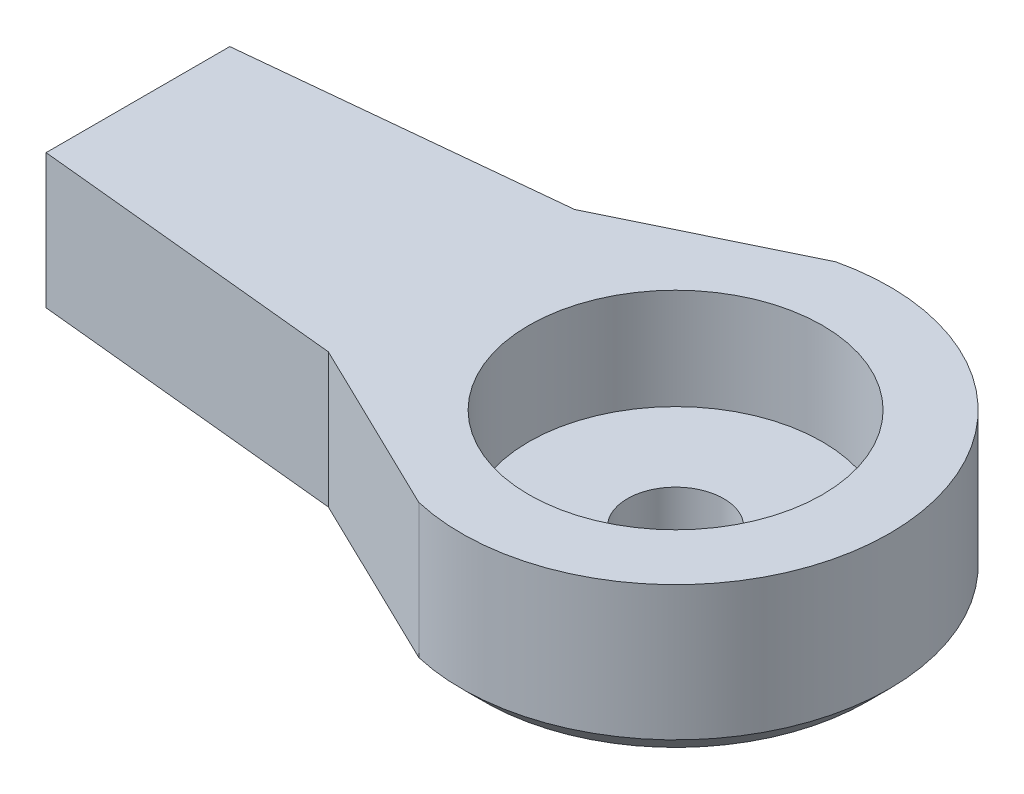
ISO-10303-21;
HEADER;
FILE_DESCRIPTION(('STEP AP214'),'2;1');
FILE_NAME('part.step','',(''),(''),'','','');
FILE_SCHEMA(('AUTOMOTIVE_DESIGN { 1 0 10303 214 1 1 1 1 }'));
ENDSEC;
DATA;
#1=APPLICATION_CONTEXT('core data for automotive mechanical design processes');
#2=APPLICATION_PROTOCOL_DEFINITION('international standard','automotive_design',2000,#1);
#3=PRODUCT_CONTEXT('',#1,'mechanical');
#4=PRODUCT('Part','Part','',(#3));
#5=PRODUCT_RELATED_PRODUCT_CATEGORY('part','',(#4));
#6=PRODUCT_DEFINITION_FORMATION('','',#4);
#7=PRODUCT_DEFINITION_CONTEXT('part definition',#1,'design');
#8=PRODUCT_DEFINITION('design','',#6,#7);
#9=PRODUCT_DEFINITION_SHAPE('','',#8);
#10=(LENGTH_UNIT() NAMED_UNIT(*) SI_UNIT(.MILLI.,.METRE.));
#11=(NAMED_UNIT(*) PLANE_ANGLE_UNIT() SI_UNIT($,.RADIAN.));
#12=(NAMED_UNIT(*) SI_UNIT($,.STERADIAN.) SOLID_ANGLE_UNIT());
#13=UNCERTAINTY_MEASURE_WITH_UNIT(LENGTH_MEASURE(1.E-05),#10,'distance_accuracy_value','');
#14=(GEOMETRIC_REPRESENTATION_CONTEXT(3) GLOBAL_UNCERTAINTY_ASSIGNED_CONTEXT((#13)) GLOBAL_UNIT_ASSIGNED_CONTEXT((#10,
#11,#12)) REPRESENTATION_CONTEXT('',''));
#15=CARTESIAN_POINT('',(0.,0.,0.));
#16=DIRECTION('',(0.,0.,1.));
#17=DIRECTION('',(1.,0.,0.));
#18=AXIS2_PLACEMENT_3D('',#15,#16,#17);
#19=CARTESIAN_POINT('',(25.,7.,0.));
#20=DIRECTION('',(0.,-1.,0.));
#21=DIRECTION('',(0.,0.,-1.));
#22=AXIS2_PLACEMENT_3D('',#19,#20,#21);
#23=CYLINDRICAL_SURFACE('',#22,2.15);
#24=CARTESIAN_POINT('',(25.,0.,0.));
#25=DIRECTION('',(0.,1.,0.));
#26=DIRECTION('',(0.,0.,1.));
#27=AXIS2_PLACEMENT_3D('',#24,#25,#26);
#28=CIRCLE('',#27,2.15);
#29=CARTESIAN_POINT('',(25.,0.,2.15));
#30=VERTEX_POINT('',#29);
#31=EDGE_CURVE('E142',#30,#30,#28,.T.);
#32=ORIENTED_EDGE('',*,*,#31,.F.);
#33=EDGE_LOOP('',(#32));
#34=FACE_BOUND('',#33,.T.);
#35=CARTESIAN_POINT('',(25.,2.5,0.));
#36=DIRECTION('',(0.,1.,0.));
#37=DIRECTION('',(0.,0.,1.));
#38=AXIS2_PLACEMENT_3D('',#35,#36,#37);
#39=CIRCLE('',#38,2.15);
#40=CARTESIAN_POINT('',(25.,2.5,2.15));
#41=VERTEX_POINT('',#40);
#42=EDGE_CURVE('E153',#41,#41,#39,.T.);
#43=ORIENTED_EDGE('',*,*,#42,.T.);
#44=EDGE_LOOP('',(#43));
#45=FACE_BOUND('',#44,.T.);
#46=ADVANCED_FACE('F35',(#34,#45),#23,.F.);
#47=CARTESIAN_POINT('',(0.696973690159836,7.,-1.4370434709497));
#48=DIRECTION('',(0.436387738536767,0.,-0.899758713019644));
#49=DIRECTION('',(-0.899758713019644,0.,-0.436387738536767));
#50=AXIS2_PLACEMENT_3D('',#47,#48,#49);
#51=PLANE('',#50);
#52=DIRECTION('',(0.,-1.,0.));
#53=VECTOR('',#52,1.);
#54=CARTESIAN_POINT('',(15.,7.,5.5));
#55=LINE('',#54,#53);
#56=CARTESIAN_POINT('',(15.,7.,5.5));
#57=VERTEX_POINT('',#56);
#58=CARTESIAN_POINT('',(15.,1.,5.5));
#59=VERTEX_POINT('',#58);
#60=EDGE_CURVE('E303',#57,#59,#55,.T.);
#61=ORIENTED_EDGE('',*,*,#60,.T.);
#62=DIRECTION('',(0.899758713019644,0.,0.436387738536767));
#63=VECTOR('',#62,1.);
#64=CARTESIAN_POINT('',(0.696973690159836,1.,-1.4370434709497));
#65=LINE('',#64,#63);
#66=CARTESIAN_POINT('',(22.840315091309,1.,9.30259432068132));
#67=VERTEX_POINT('',#66);
#68=EDGE_CURVE('E11',#59,#67,#65,.T.);
#69=ORIENTED_EDGE('',*,*,#68,.T.);
#70=DIRECTION('',(0.,-1.,0.));
#71=VECTOR('',#70,1.);
#72=CARTESIAN_POINT('',(22.840315091309,7.,9.30259432068132));
#73=LINE('',#72,#71);
#74=CARTESIAN_POINT('',(22.840315091309,7.,9.30259432068132));
#75=VERTEX_POINT('',#74);
#76=EDGE_CURVE('E127',#75,#67,#73,.T.);
#77=ORIENTED_EDGE('',*,*,#76,.F.);
#78=DIRECTION('',(0.899758713019644,0.,0.436387738536767));
#79=VECTOR('',#78,1.);
#80=CARTESIAN_POINT('',(0.696973690159836,7.,-1.4370434709497));
#81=LINE('',#80,#79);
#82=EDGE_CURVE('E134',#57,#75,#81,.T.);
#83=ORIENTED_EDGE('',*,*,#82,.F.);
#84=EDGE_LOOP('',(#61,#69,#77,#83));
#85=FACE_BOUND('',#84,.T.);
#86=ADVANCED_FACE('F144',(#85),#51,.F.);
#87=CARTESIAN_POINT('',(25.,7.,0.));
#88=DIRECTION('',(0.,-1.,0.));
#89=DIRECTION('',(0.,0.,-1.));
#90=AXIS2_PLACEMENT_3D('',#87,#88,#89);
#91=CYLINDRICAL_SURFACE('',#90,9.55);
#92=ORIENTED_EDGE('',*,*,#76,.T.);
#93=CARTESIAN_POINT('',(25.,1.,0.));
#94=DIRECTION('',(0.,1.,0.));
#95=DIRECTION('',(0.,0.,1.));
#96=AXIS2_PLACEMENT_3D('',#93,#94,#95);
#97=CIRCLE('',#96,9.55);
#98=CARTESIAN_POINT('',(22.840315091309,1.,-9.30259432068132));
#99=VERTEX_POINT('',#98);
#100=EDGE_CURVE('E45',#67,#99,#97,.T.);
#101=ORIENTED_EDGE('',*,*,#100,.T.);
#102=DIRECTION('',(0.,-1.,0.));
#103=VECTOR('',#102,1.);
#104=CARTESIAN_POINT('',(22.840315091309,7.,-9.30259432068132));
#105=LINE('',#104,#103);
#106=CARTESIAN_POINT('',(22.840315091309,7.,-9.30259432068132));
#107=VERTEX_POINT('',#106);
#108=EDGE_CURVE('E129',#107,#99,#105,.T.);
#109=ORIENTED_EDGE('',*,*,#108,.F.);
#110=CARTESIAN_POINT('',(25.,7.,0.));
#111=DIRECTION('',(0.,1.,0.));
#112=DIRECTION('',(0.,0.,1.));
#113=AXIS2_PLACEMENT_3D('',#110,#111,#112);
#114=CIRCLE('',#113,9.55);
#115=EDGE_CURVE('E124',#75,#107,#114,.T.);
#116=ORIENTED_EDGE('',*,*,#115,.F.);
#117=EDGE_LOOP('',(#92,#101,#109,#116));
#118=FACE_BOUND('',#117,.T.);
#119=ADVANCED_FACE('F126',(#118),#91,.T.);
#120=CARTESIAN_POINT('',(0.696973690159848,7.,1.43704347094972));
#121=DIRECTION('',(-0.436387738536768,0.,-0.899758713019644));
#122=DIRECTION('',(-0.899758713019644,0.,0.436387738536768));
#123=AXIS2_PLACEMENT_3D('',#120,#121,#122);
#124=PLANE('',#123);
#125=ORIENTED_EDGE('',*,*,#108,.T.);
#126=DIRECTION('',(-0.899758713019644,0.,0.436387738536768));
#127=VECTOR('',#126,1.);
#128=CARTESIAN_POINT('',(15.,1.,-5.5));
#129=LINE('',#128,#127);
#130=CARTESIAN_POINT('',(15.,1.,-5.5));
#131=VERTEX_POINT('',#130);
#132=EDGE_CURVE('E192',#99,#131,#129,.T.);
#133=ORIENTED_EDGE('',*,*,#132,.T.);
#134=DIRECTION('',(0.,-1.,0.));
#135=VECTOR('',#134,1.);
#136=CARTESIAN_POINT('',(15.,7.,-5.5));
#137=LINE('',#136,#135);
#138=CARTESIAN_POINT('',(15.,7.,-5.5));
#139=VERTEX_POINT('',#138);
#140=EDGE_CURVE('E149',#139,#131,#137,.T.);
#141=ORIENTED_EDGE('',*,*,#140,.F.);
#142=DIRECTION('',(0.899758713019644,0.,-0.436387738536768));
#143=VECTOR('',#142,1.);
#144=CARTESIAN_POINT('',(0.696973690159848,7.,1.43704347094972));
#145=LINE('',#144,#143);
#146=EDGE_CURVE('E133',#139,#107,#145,.T.);
#147=ORIENTED_EDGE('',*,*,#146,.T.);
#148=EDGE_LOOP('',(#125,#133,#141,#147));
#149=FACE_BOUND('',#148,.T.);
#150=ADVANCED_FACE('F298',(#149),#124,.T.);
#151=CARTESIAN_POINT('',(-0.396039603960395,7.,-3.96039603960396));
#152=DIRECTION('',(-0.0995037190209987,0.,-0.995037190209989));
#153=DIRECTION('',(-0.995037190209989,0.,0.0995037190209987));
#154=AXIS2_PLACEMENT_3D('',#151,#152,#153);
#155=PLANE('',#154);
#156=DIRECTION('',(0.,1.,0.));
#157=VECTOR('',#156,1.);
#158=CARTESIAN_POINT('',(0.995037190209998,7.,-4.099503719021));
#159=LINE('',#158,#157);
#160=CARTESIAN_POINT('',(0.995037190209998,1.,-4.099503719021));
#161=VERTEX_POINT('',#160);
#162=CARTESIAN_POINT('',(0.995037190209998,6.99503719020999,-4.099503719021));
#163=VERTEX_POINT('',#162);
#164=EDGE_CURVE('E166',#161,#163,#159,.T.);
#165=ORIENTED_EDGE('',*,*,#164,.T.);
#166=DIRECTION('',(-0.705345615858598,-0.705345615858598,0.0705345615858597));
#167=VECTOR('',#166,1.);
#168=CARTESIAN_POINT('',(0.29850746268657,6.29850746268657,-4.02985074626866));
#169=LINE('',#168,#167);
#170=CARTESIAN_POINT('',(1.,7.,-4.1));
#171=VERTEX_POINT('',#170);
#172=EDGE_CURVE('E169',#163,#171,#169,.F.);
#173=ORIENTED_EDGE('',*,*,#172,.T.);
#174=DIRECTION('',(0.995037190209989,0.,-0.0995037190209987));
#175=VECTOR('',#174,1.);
#176=CARTESIAN_POINT('',(-0.396039603960395,7.,-3.96039603960396));
#177=LINE('',#176,#175);
#178=EDGE_CURVE('E302',#171,#139,#177,.T.);
#179=ORIENTED_EDGE('',*,*,#178,.T.);
#180=ORIENTED_EDGE('',*,*,#140,.T.);
#181=DIRECTION('',(-0.995037190209989,0.,0.0995037190209987));
#182=VECTOR('',#181,1.);
#183=CARTESIAN_POINT('',(0.,1.,-4.));
#184=LINE('',#183,#182);
#185=EDGE_CURVE('E164',#131,#161,#184,.T.);
#186=ORIENTED_EDGE('',*,*,#185,.T.);
#187=EDGE_LOOP('',(#165,#173,#179,#180,#186));
#188=FACE_BOUND('',#187,.T.);
#189=ADVANCED_FACE('F300',(#188),#155,.T.);
#190=CARTESIAN_POINT('',(0.,7.,0.));
#191=DIRECTION('',(-1.,0.,0.));
#192=DIRECTION('',(0.,0.,1.));
#193=AXIS2_PLACEMENT_3D('',#190,#191,#192);
#194=PLANE('',#193);
#195=DIRECTION('',(0.,0.,-1.));
#196=VECTOR('',#195,1.);
#197=CARTESIAN_POINT('',(0.,6.,0.));
#198=LINE('',#197,#196);
#199=CARTESIAN_POINT('',(0.,6.,3.));
#200=VERTEX_POINT('',#199);
#201=CARTESIAN_POINT('',(0.,6.,-3.));
#202=VERTEX_POINT('',#201);
#203=EDGE_CURVE('E159',#200,#202,#198,.T.);
#204=ORIENTED_EDGE('',*,*,#203,.T.);
#205=DIRECTION('',(0.,-1.,0.));
#206=VECTOR('',#205,1.);
#207=CARTESIAN_POINT('',(0.,7.,-3.));
#208=LINE('',#207,#206);
#209=CARTESIAN_POINT('',(0.,1.,-3.));
#210=VERTEX_POINT('',#209);
#211=EDGE_CURVE('E161',#202,#210,#208,.T.);
#212=ORIENTED_EDGE('',*,*,#211,.T.);
#213=DIRECTION('',(0.,0.,1.));
#214=VECTOR('',#213,1.);
#215=CARTESIAN_POINT('',(0.,1.,4.));
#216=LINE('',#215,#214);
#217=CARTESIAN_POINT('',(0.,1.,3.));
#218=VERTEX_POINT('',#217);
#219=EDGE_CURVE('E145',#210,#218,#216,.T.);
#220=ORIENTED_EDGE('',*,*,#219,.T.);
#221=DIRECTION('',(0.,1.,0.));
#222=VECTOR('',#221,1.);
#223=CARTESIAN_POINT('',(0.,7.,3.));
#224=LINE('',#223,#222);
#225=EDGE_CURVE('E147',#218,#200,#224,.T.);
#226=ORIENTED_EDGE('',*,*,#225,.T.);
#227=EDGE_LOOP('',(#204,#212,#220,#226));
#228=FACE_BOUND('',#227,.T.);
#229=CARTESIAN_POINT('',(0.,3.5,0.));
#230=DIRECTION('',(-1.,0.,0.));
#231=DIRECTION('',(0.,0.,1.));
#232=AXIS2_PLACEMENT_3D('',#229,#230,#231);
#233=CIRCLE('',#232,1.975);
#234=CARTESIAN_POINT('',(0.,3.5,1.975));
#235=VERTEX_POINT('',#234);
#236=EDGE_CURVE('E155',#235,#235,#233,.T.);
#237=ORIENTED_EDGE('',*,*,#236,.F.);
#238=EDGE_LOOP('',(#237));
#239=FACE_BOUND('',#238,.T.);
#240=ADVANCED_FACE('F276',(#228,#239),#194,.T.);
#241=CARTESIAN_POINT('',(-0.396039603960397,7.,3.96039603960396));
#242=DIRECTION('',(0.0995037190209992,0.,-0.995037190209989));
#243=DIRECTION('',(-0.995037190209989,0.,-0.0995037190209992));
#244=AXIS2_PLACEMENT_3D('',#241,#242,#243);
#245=PLANE('',#244);
#246=DIRECTION('',(0.995037190209989,0.,0.0995037190209992));
#247=VECTOR('',#246,1.);
#248=CARTESIAN_POINT('',(-0.396039603960397,7.,3.96039603960396));
#249=LINE('',#248,#247);
#250=CARTESIAN_POINT('',(1.,7.,4.1));
#251=VERTEX_POINT('',#250);
#252=EDGE_CURVE('E140',#251,#57,#249,.T.);
#253=ORIENTED_EDGE('',*,*,#252,.F.);
#254=DIRECTION('',(0.705345615858598,0.705345615858598,0.07053456158586));
#255=VECTOR('',#254,1.);
#256=CARTESIAN_POINT('',(-0.199004975124379,5.80099502487562,3.98009950248756));
#257=LINE('',#256,#255);
#258=CARTESIAN_POINT('',(0.995037190209994,6.99503719020999,4.099503719021));
#259=VERTEX_POINT('',#258);
#260=EDGE_CURVE('E177',#251,#259,#257,.F.);
#261=ORIENTED_EDGE('',*,*,#260,.T.);
#262=DIRECTION('',(0.,-1.,0.));
#263=VECTOR('',#262,1.);
#264=CARTESIAN_POINT('',(0.995037190209994,0.,4.099503719021));
#265=LINE('',#264,#263);
#266=CARTESIAN_POINT('',(0.995037190209994,1.,4.099503719021));
#267=VERTEX_POINT('',#266);
#268=EDGE_CURVE('E175',#259,#267,#265,.T.);
#269=ORIENTED_EDGE('',*,*,#268,.T.);
#270=DIRECTION('',(0.995037190209989,0.,0.0995037190209992));
#271=VECTOR('',#270,1.);
#272=CARTESIAN_POINT('',(-0.396039603960397,1.,3.96039603960396));
#273=LINE('',#272,#271);
#274=EDGE_CURVE('E173',#267,#59,#273,.T.);
#275=ORIENTED_EDGE('',*,*,#274,.T.);
#276=ORIENTED_EDGE('',*,*,#60,.F.);
#277=EDGE_LOOP('',(#253,#261,#269,#275,#276));
#278=FACE_BOUND('',#277,.T.);
#279=ADVANCED_FACE('F330',(#278),#245,.F.);
#280=CARTESIAN_POINT('',(0.,7.,0.));
#281=DIRECTION('',(0.,1.,0.));
#282=DIRECTION('',(0.,0.,1.));
#283=AXIS2_PLACEMENT_3D('',#280,#281,#282);
#284=PLANE('',#283);
#285=CARTESIAN_POINT('',(25.,7.,0.));
#286=DIRECTION('',(0.,1.,0.));
#287=DIRECTION('',(0.,0.,1.));
#288=AXIS2_PLACEMENT_3D('',#285,#286,#287);
#289=CIRCLE('',#288,6.55);
#290=CARTESIAN_POINT('',(25.,7.,6.55));
#291=VERTEX_POINT('',#290);
#292=EDGE_CURVE('E261',#291,#291,#289,.T.);
#293=ORIENTED_EDGE('',*,*,#292,.F.);
#294=EDGE_LOOP('',(#293));
#295=FACE_BOUND('',#294,.T.);
#296=ORIENTED_EDGE('',*,*,#178,.F.);
#297=DIRECTION('',(0.,0.,1.));
#298=VECTOR('',#297,1.);
#299=CARTESIAN_POINT('',(1.,7.,0.));
#300=LINE('',#299,#298);
#301=EDGE_CURVE('E171',#171,#251,#300,.T.);
#302=ORIENTED_EDGE('',*,*,#301,.T.);
#303=ORIENTED_EDGE('',*,*,#252,.T.);
#304=ORIENTED_EDGE('',*,*,#82,.T.);
#305=ORIENTED_EDGE('',*,*,#115,.T.);
#306=ORIENTED_EDGE('',*,*,#146,.F.);
#307=EDGE_LOOP('',(#296,#302,#303,#304,#305,#306));
#308=FACE_BOUND('',#307,.T.);
#309=ADVANCED_FACE('F138',(#295,#308),#284,.T.);
#310=CARTESIAN_POINT('',(0.,0.,0.));
#311=DIRECTION('',(0.,1.,0.));
#312=DIRECTION('',(0.,0.,1.));
#313=AXIS2_PLACEMENT_3D('',#310,#311,#312);
#314=PLANE('',#313);
#315=DIRECTION('',(-0.995037190209989,0.,-0.0995037190209992));
#316=VECTOR('',#315,1.);
#317=CARTESIAN_POINT('',(-0.296535884939398,0.,2.96535884939397));
#318=LINE('',#317,#316);
#319=CARTESIAN_POINT('',(15.2764157165793,0.,4.52265400954584));
#320=VERTEX_POINT('',#319);
#321=CARTESIAN_POINT('',(1.,0.,3.09501243788791));
#322=VERTEX_POINT('',#321);
#323=EDGE_CURVE('E179',#320,#322,#318,.T.);
#324=ORIENTED_EDGE('',*,*,#323,.T.);
#325=DIRECTION('',(0.,0.,-1.));
#326=VECTOR('',#325,1.);
#327=CARTESIAN_POINT('',(1.,0.,-4.));
#328=LINE('',#327,#326);
#329=CARTESIAN_POINT('',(1.,0.,-3.09501243788791));
#330=VERTEX_POINT('',#329);
#331=EDGE_CURVE('E189',#322,#330,#328,.T.);
#332=ORIENTED_EDGE('',*,*,#331,.T.);
#333=DIRECTION('',(0.995037190209989,0.,-0.0995037190209987));
#334=VECTOR('',#333,1.);
#335=CARTESIAN_POINT('',(15.099503719021,0.,-4.50496280979001));
#336=LINE('',#335,#334);
#337=CARTESIAN_POINT('',(15.2764157165793,0.,-4.52265400954584));
#338=VERTEX_POINT('',#337);
#339=EDGE_CURVE('E187',#330,#338,#336,.T.);
#340=ORIENTED_EDGE('',*,*,#339,.T.);
#341=DIRECTION('',(0.899758713019644,0.,-0.436387738536768));
#342=VECTOR('',#341,1.);
#343=CARTESIAN_POINT('',(23.2767028298458,0.,-8.40283560766168));
#344=LINE('',#343,#342);
#345=CARTESIAN_POINT('',(23.1729235923637,0.,-8.35250212814453));
#346=VERTEX_POINT('',#345);
#347=EDGE_CURVE('E185',#338,#346,#344,.T.);
#348=ORIENTED_EDGE('',*,*,#347,.T.);
#349=CARTESIAN_POINT('',(25.,0.,0.));
#350=DIRECTION('',(0.,1.,0.));
#351=DIRECTION('',(0.,0.,1.));
#352=AXIS2_PLACEMENT_3D('',#349,#350,#351);
#353=CIRCLE('',#352,8.54999999999999);
#354=CARTESIAN_POINT('',(23.1729235923636,0.,8.35250212814479));
#355=VERTEX_POINT('',#354);
#356=EDGE_CURVE('E183',#346,#355,#353,.F.);
#357=ORIENTED_EDGE('',*,*,#356,.T.);
#358=DIRECTION('',(-0.899758713019644,0.,-0.436387738536767));
#359=VECTOR('',#358,1.);
#360=CARTESIAN_POINT('',(1.1333614286966,0.,-2.33680218396935));
#361=LINE('',#360,#359);
#362=EDGE_CURVE('E181',#355,#320,#361,.T.);
#363=ORIENTED_EDGE('',*,*,#362,.T.);
#364=EDGE_LOOP('',(#324,#332,#340,#348,#357,#363));
#365=FACE_BOUND('',#364,.T.);
#366=ORIENTED_EDGE('',*,*,#31,.T.);
#367=EDGE_LOOP('',(#366));
#368=FACE_BOUND('',#367,.T.);
#369=ADVANCED_FACE('F286',(#365,#368),#314,.F.);
#370=CARTESIAN_POINT('',(15.,3.5,0.));
#371=DIRECTION('',(-1.,0.,0.));
#372=DIRECTION('',(0.,0.,1.));
#373=AXIS2_PLACEMENT_3D('',#370,#371,#372);
#374=CYLINDRICAL_SURFACE('',#373,1.975);
#375=CARTESIAN_POINT('',(15.,3.5,0.));
#376=DIRECTION('',(-1.,0.,0.));
#377=DIRECTION('',(0.,0.,1.));
#378=AXIS2_PLACEMENT_3D('',#375,#376,#377);
#379=CIRCLE('',#378,1.975);
#380=CARTESIAN_POINT('',(15.,3.5,1.975));
#381=VERTEX_POINT('',#380);
#382=EDGE_CURVE('E308',#381,#381,#379,.T.);
#383=ORIENTED_EDGE('',*,*,#382,.F.);
#384=EDGE_LOOP('',(#383));
#385=FACE_BOUND('',#384,.T.);
#386=ORIENTED_EDGE('',*,*,#236,.T.);
#387=EDGE_LOOP('',(#386));
#388=FACE_BOUND('',#387,.T.);
#389=ADVANCED_FACE('F336',(#385,#388),#374,.F.);
#390=CARTESIAN_POINT('',(15.,3.5,0.));
#391=DIRECTION('',(-1.,0.,0.));
#392=DIRECTION('',(0.,0.,1.));
#393=AXIS2_PLACEMENT_3D('',#390,#391,#392);
#394=PLANE('',#393);
#395=ORIENTED_EDGE('',*,*,#382,.T.);
#396=EDGE_LOOP('',(#395));
#397=FACE_BOUND('',#396,.T.);
#398=ADVANCED_FACE('F325',(#397),#394,.T.);
#399=CARTESIAN_POINT('',(25.,2.5,0.));
#400=DIRECTION('',(0.,1.,0.));
#401=DIRECTION('',(0.,0.,1.));
#402=AXIS2_PLACEMENT_3D('',#399,#400,#401);
#403=CYLINDRICAL_SURFACE('',#402,6.55);
#404=CARTESIAN_POINT('',(25.,2.5,0.));
#405=DIRECTION('',(0.,1.,0.));
#406=DIRECTION('',(0.,0.,1.));
#407=AXIS2_PLACEMENT_3D('',#404,#405,#406);
#408=CIRCLE('',#407,6.55);
#409=CARTESIAN_POINT('',(25.,2.5,6.55));
#410=VERTEX_POINT('',#409);
#411=EDGE_CURVE('E156',#410,#410,#408,.T.);
#412=ORIENTED_EDGE('',*,*,#411,.F.);
#413=EDGE_LOOP('',(#412));
#414=FACE_BOUND('',#413,.T.);
#415=ORIENTED_EDGE('',*,*,#292,.T.);
#416=EDGE_LOOP('',(#415));
#417=FACE_BOUND('',#416,.T.);
#418=ADVANCED_FACE('F322',(#414,#417),#403,.F.);
#419=CARTESIAN_POINT('',(25.,2.5,0.));
#420=DIRECTION('',(0.,1.,0.));
#421=DIRECTION('',(0.,0.,1.));
#422=AXIS2_PLACEMENT_3D('',#419,#420,#421);
#423=PLANE('',#422);
#424=ORIENTED_EDGE('',*,*,#42,.F.);
#425=EDGE_LOOP('',(#424));
#426=FACE_BOUND('',#425,.T.);
#427=ORIENTED_EDGE('',*,*,#411,.T.);
#428=EDGE_LOOP('',(#427));
#429=FACE_BOUND('',#428,.T.);
#430=ADVANCED_FACE('F250',(#426,#429),#423,.T.);
#431=CARTESIAN_POINT('',(0.696973690159836,1.,-1.4370434709497));
#432=DIRECTION('',(0.30857272914601,0.707106781186548,-0.63622548740787));
#433=DIRECTION('',(0.899758713019644,0.,0.436387738536767));
#434=AXIS2_PLACEMENT_3D('',#431,#432,#433);
#435=PLANE('',#434);
#436=CARTESIAN_POINT('',(23.1729235923637,0.,8.35250212814453));
#437=CARTESIAN_POINT('',(23.1179835404148,0.166635833046047,8.5110564893936));
#438=CARTESIAN_POINT('',(23.0627961373631,0.333287088832168,8.66950802502172));
#439=CARTESIAN_POINT('',(22.9519266369416,0.666620422169863,8.98620542250491));
#440=CARTESIAN_POINT('',(22.8962445396422,0.833302499717046,9.14445128438923));
#441=CARTESIAN_POINT('',(22.8403150913103,0.999999999999915,9.30259432068187));
#442=B_SPLINE_CURVE_WITH_KNOTS('',3,(#436,#437,#438,#439,#440,#441),.UNSPECIFIED.,.F.,.F.,(4,2,
4),(0.,0.709455154948065,1.41891020894905),.UNSPECIFIED.);
#443=EDGE_CURVE('E252',#67,#355,#442,.F.);
#444=ORIENTED_EDGE('',*,*,#443,.F.);
#445=ORIENTED_EDGE('',*,*,#68,.F.);
#446=DIRECTION('',(-0.193928872609111,0.701584103136481,0.685690410166818));
#447=VECTOR('',#446,1.);
#448=CARTESIAN_POINT('',(15.3845404785541,-0.391167200305691,4.1403483147299));
#449=LINE('',#448,#447);
#450=EDGE_CURVE('E40',#320,#59,#449,.T.);
#451=ORIENTED_EDGE('',*,*,#450,.F.);
#452=ORIENTED_EDGE('',*,*,#362,.F.);
#453=EDGE_LOOP('',(#444,#445,#451,#452));
#454=FACE_BOUND('',#453,.T.);
#455=ADVANCED_FACE('F245',(#454),#435,.F.);
#456=CARTESIAN_POINT('',(-0.396039603960397,1.,3.96039603960396));
#457=DIRECTION('',(0.0703597544730294,0.707106781186548,-0.703597544730292));
#458=DIRECTION('',(0.995037190209989,0.,0.0995037190209992));
#459=AXIS2_PLACEMENT_3D('',#456,#457,#458);
#460=PLANE('',#459);
#461=ORIENTED_EDGE('',*,*,#450,.T.);
#462=ORIENTED_EDGE('',*,*,#274,.F.);
#463=DIRECTION('',(0.00350134337821129,-0.705516335778305,-0.708685007986272));
#464=VECTOR('',#463,1.);
#465=CARTESIAN_POINT('',(0.995037190209994,1.,4.099503719021));
#466=LINE('',#465,#464);
#467=EDGE_CURVE('E225',#322,#267,#466,.F.);
#468=ORIENTED_EDGE('',*,*,#467,.F.);
#469=ORIENTED_EDGE('',*,*,#323,.F.);
#470=EDGE_LOOP('',(#461,#462,#468,#469));
#471=FACE_BOUND('',#470,.T.);
#472=ADVANCED_FACE('F38',(#471),#460,.F.);
#473=CARTESIAN_POINT('',(25.,1.,0.));
#474=DIRECTION('',(0.,1.,0.));
#475=DIRECTION('',(0.,0.,1.));
#476=AXIS2_PLACEMENT_3D('',#473,#474,#475);
#477=CONICAL_SURFACE('',#476,9.55,0.78539816339745);
#478=ORIENTED_EDGE('',*,*,#443,.T.);
#479=ORIENTED_EDGE('',*,*,#356,.F.);
#480=CARTESIAN_POINT('',(23.1729235923637,0.,-8.35250212814482));
#481=CARTESIAN_POINT('',(23.1179835404148,0.166635833046097,-8.51105648939379));
#482=CARTESIAN_POINT('',(23.062796137363,0.333287088832243,-8.66950802502184));
#483=CARTESIAN_POINT('',(22.9519266369415,0.666620422169937,-8.98620542250493));
#484=CARTESIAN_POINT('',(22.8962445396422,0.833302499717096,-9.14445128438923));
#485=CARTESIAN_POINT('',(22.8403150913103,0.999999999999915,-9.30259432068187));
#486=B_SPLINE_CURVE_WITH_KNOTS('',3,(#480,#481,#482,#483,#484,#485),.UNSPECIFIED.,.F.,.F.,(4,2,
4),(0.,0.709455154947959,1.41891020894884),.UNSPECIFIED.);
#487=EDGE_CURVE('E216',#99,#346,#486,.F.);
#488=ORIENTED_EDGE('',*,*,#487,.F.);
#489=ORIENTED_EDGE('',*,*,#100,.F.);
#490=EDGE_LOOP('',(#478,#479,#488,#489));
#491=FACE_BOUND('',#490,.T.);
#492=ADVANCED_FACE('F227',(#491),#477,.T.);
#493=CARTESIAN_POINT('',(0.995037190209994,1.,4.099503719021));
#494=DIRECTION('',(-0.61378279057609,-0.561006631580406,0.555465791309811));
#495=DIRECTION('',(0.674660321947016,-0.738128342492245,0.));
#496=AXIS2_PLACEMENT_3D('',#493,#494,#495);
#497=PLANE('',#496);
#498=DIRECTION('',(0.705516335778305,-0.705516335778305,0.0670328270320451));
#499=VECTOR('',#498,1.);
#500=CARTESIAN_POINT('',(0.547281604560006,0.452718395439995,3.05199855946045));
#501=LINE('',#500,#499);
#502=EDGE_CURVE('E210',#322,#218,#501,.F.);
#503=ORIENTED_EDGE('',*,*,#502,.F.);
#504=ORIENTED_EDGE('',*,*,#467,.T.);
#505=DIRECTION('',(-0.671005320760947,0.,-0.741452533551878));
#506=VECTOR('',#505,1.);
#507=CARTESIAN_POINT('',(0.995037190209994,1.,4.099503719021));
#508=LINE('',#507,#506);
#509=EDGE_CURVE('E213',#218,#267,#508,.F.);
#510=ORIENTED_EDGE('',*,*,#509,.F.);
#511=EDGE_LOOP('',(#503,#504,#510));
#512=FACE_BOUND('',#511,.T.);
#513=ADVANCED_FACE('F239',(#512),#497,.T.);
#514=CARTESIAN_POINT('',(1.13336142869662,0.,2.33680218396937));
#515=DIRECTION('',(-0.30857272914601,-0.707106781186549,-0.63622548740787));
#516=DIRECTION('',(-0.899758713019644,0.,0.436387738536768));
#517=AXIS2_PLACEMENT_3D('',#514,#515,#516);
#518=PLANE('',#517);
#519=ORIENTED_EDGE('',*,*,#487,.T.);
#520=ORIENTED_EDGE('',*,*,#347,.F.);
#521=DIRECTION('',(-0.193928872609111,0.701584103136481,-0.685690410166818));
#522=VECTOR('',#521,1.);
#523=CARTESIAN_POINT('',(14.8978233905869,1.3696483350426,-5.86127431813193));
#524=LINE('',#523,#522);
#525=EDGE_CURVE('E207',#131,#338,#524,.F.);
#526=ORIENTED_EDGE('',*,*,#525,.F.);
#527=ORIENTED_EDGE('',*,*,#132,.F.);
#528=EDGE_LOOP('',(#519,#520,#526,#527));
#529=FACE_BOUND('',#528,.T.);
#530=ADVANCED_FACE('F231',(#529),#518,.T.);
#531=CARTESIAN_POINT('',(0.995037190209994,7.,4.099503719021));
#532=DIRECTION('',(-0.741452533551878,0.,0.671005320760947));
#533=DIRECTION('',(0.,1.,0.));
#534=AXIS2_PLACEMENT_3D('',#531,#532,#533);
#535=PLANE('',#534);
#536=ORIENTED_EDGE('',*,*,#509,.T.);
#537=ORIENTED_EDGE('',*,*,#268,.F.);
#538=DIRECTION('',(0.557191914001243,0.557191914001243,0.615690134680802));
#539=VECTOR('',#538,1.);
#540=CARTESIAN_POINT('',(0.99657795817733,6.99657795817733,4.10120624846101));
#541=LINE('',#540,#539);
#542=EDGE_CURVE('E204',#200,#259,#541,.T.);
#543=ORIENTED_EDGE('',*,*,#542,.F.);
#544=ORIENTED_EDGE('',*,*,#225,.F.);
#545=EDGE_LOOP('',(#536,#537,#543,#544));
#546=FACE_BOUND('',#545,.T.);
#547=ADVANCED_FACE('F238',(#546),#535,.T.);
#548=CARTESIAN_POINT('',(1.,0.,0.));
#549=DIRECTION('',(-0.707106781186547,-0.707106781186548,0.));
#550=DIRECTION('',(0.,0.,1.));
#551=AXIS2_PLACEMENT_3D('',#548,#549,#550);
#552=PLANE('',#551);
#553=ORIENTED_EDGE('',*,*,#502,.T.);
#554=ORIENTED_EDGE('',*,*,#219,.F.);
#555=DIRECTION('',(-0.705516335778305,0.705516335778305,0.0670328270320449));
#556=VECTOR('',#555,1.);
#557=CARTESIAN_POINT('',(0.,1.,-3.));
#558=LINE('',#557,#556);
#559=EDGE_CURVE('E201',#330,#210,#558,.T.);
#560=ORIENTED_EDGE('',*,*,#559,.F.);
#561=ORIENTED_EDGE('',*,*,#331,.F.);
#562=EDGE_LOOP('',(#553,#554,#560,#561));
#563=FACE_BOUND('',#562,.T.);
#564=ADVANCED_FACE('F283',(#563),#552,.T.);
#565=CARTESIAN_POINT('',(-0.296535884939396,0.,-2.96535884939397));
#566=DIRECTION('',(-0.070359754473029,-0.707106781186548,-0.703597544730291));
#567=DIRECTION('',(-0.995037190209989,0.,0.0995037190209987));
#568=AXIS2_PLACEMENT_3D('',#565,#566,#567);
#569=PLANE('',#568);
#570=ORIENTED_EDGE('',*,*,#525,.T.);
#571=ORIENTED_EDGE('',*,*,#339,.F.);
#572=DIRECTION('',(0.00350134337820747,-0.705516335778304,0.708685007986272));
#573=VECTOR('',#572,1.);
#574=CARTESIAN_POINT('',(0.997753244714997,0.452718395439993,-3.54976411891595));
#575=LINE('',#574,#573);
#576=EDGE_CURVE('E199',#161,#330,#575,.T.);
#577=ORIENTED_EDGE('',*,*,#576,.F.);
#578=ORIENTED_EDGE('',*,*,#185,.F.);
#579=EDGE_LOOP('',(#570,#571,#577,#578));
#580=FACE_BOUND('',#579,.T.);
#581=ADVANCED_FACE('F372',(#580),#569,.T.);
#582=CARTESIAN_POINT('',(0.,6.,0.));
#583=DIRECTION('',(0.707106781186548,-0.707106781186548,0.));
#584=DIRECTION('',(0.,0.,-1.));
#585=AXIS2_PLACEMENT_3D('',#582,#583,#584);
#586=PLANE('',#585);
#587=ORIENTED_EDGE('',*,*,#301,.F.);
#588=ORIENTED_EDGE('',*,*,#172,.F.);
#589=DIRECTION('',(-0.557191914001243,-0.557191914001243,0.6156901346808));
#590=VECTOR('',#589,1.);
#591=CARTESIAN_POINT('',(-1.02917269372343,4.97082730627656,-1.86277697417021));
#592=LINE('',#591,#590);
#593=EDGE_CURVE('E197',#202,#163,#592,.F.);
#594=ORIENTED_EDGE('',*,*,#593,.F.);
#595=ORIENTED_EDGE('',*,*,#203,.F.);
#596=ORIENTED_EDGE('',*,*,#542,.T.);
#597=ORIENTED_EDGE('',*,*,#260,.F.);
#598=EDGE_LOOP('',(#587,#588,#594,#595,#596,#597));
#599=FACE_BOUND('',#598,.T.);
#600=ADVANCED_FACE('F365',(#599),#586,.F.);
#601=CARTESIAN_POINT('',(0.,1.,-3.));
#602=DIRECTION('',(-0.613782790576089,-0.561006631580405,-0.555465791309812));
#603=DIRECTION('',(0.674660321947016,-0.738128342492245,0.));
#604=AXIS2_PLACEMENT_3D('',#601,#602,#603);
#605=PLANE('',#604);
#606=ORIENTED_EDGE('',*,*,#576,.T.);
#607=ORIENTED_EDGE('',*,*,#559,.T.);
#608=DIRECTION('',(-0.671005320760948,0.,0.741452533551877));
#609=VECTOR('',#608,1.);
#610=CARTESIAN_POINT('',(0.,1.,-3.));
#611=LINE('',#610,#609);
#612=EDGE_CURVE('E195',#161,#210,#611,.T.);
#613=ORIENTED_EDGE('',*,*,#612,.F.);
#614=EDGE_LOOP('',(#606,#607,#613));
#615=FACE_BOUND('',#614,.T.);
#616=ADVANCED_FACE('F359',(#615),#605,.T.);
#617=CARTESIAN_POINT('',(0.,7.,-3.));
#618=DIRECTION('',(0.741452533551877,0.,0.671005320760948));
#619=DIRECTION('',(0.,-1.,0.));
#620=AXIS2_PLACEMENT_3D('',#617,#618,#619);
#621=PLANE('',#620);
#622=ORIENTED_EDGE('',*,*,#593,.T.);
#623=ORIENTED_EDGE('',*,*,#164,.F.);
#624=ORIENTED_EDGE('',*,*,#612,.T.);
#625=ORIENTED_EDGE('',*,*,#211,.F.);
#626=EDGE_LOOP('',(#622,#623,#624,#625));
#627=FACE_BOUND('',#626,.T.);
#628=ADVANCED_FACE('F353',(#627),#621,.F.);
#629=CLOSED_SHELL('',(#46,#86,#119,#150,#189,#240,#279,#309,#369,#389,#398,#418,#430,#455,#472,
#492,#513,#530,#547,#564,#581,#600,#616,#628));
#630=MANIFOLD_SOLID_BREP('B2',#629);
#631=ADVANCED_BREP_SHAPE_REPRESENTATION('',(#18,#630),#14);
#632=SHAPE_DEFINITION_REPRESENTATION(#9,#631);
ENDSEC;
END-ISO-10303-21;
